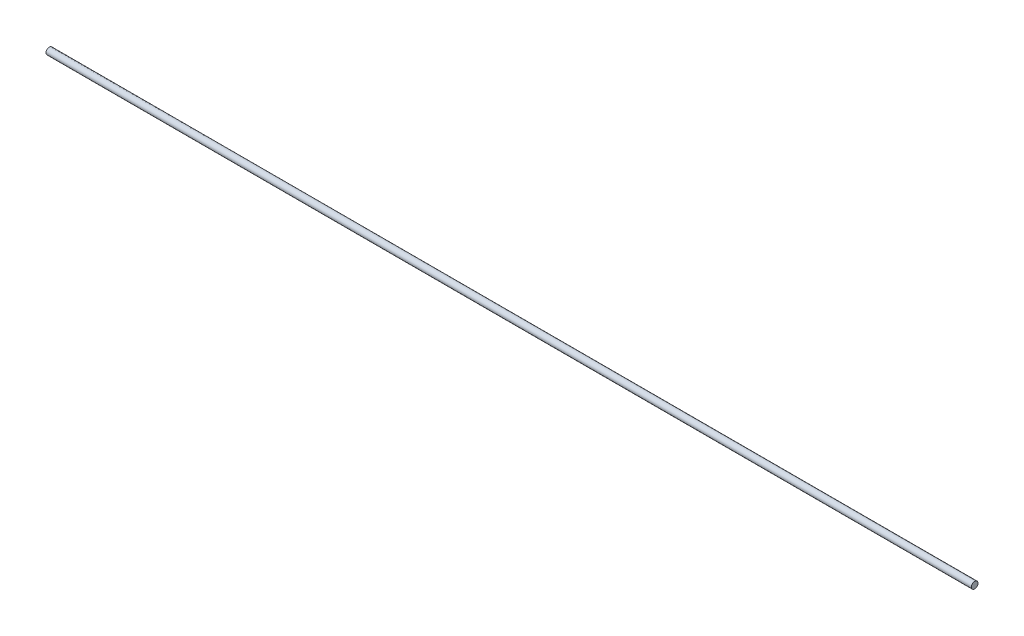
ISO-10303-21;
HEADER;
FILE_DESCRIPTION(('STEP AP214'),'2;1');
FILE_NAME('part.step','',(''),(''),'','','');
FILE_SCHEMA(('AUTOMOTIVE_DESIGN { 1 0 10303 214 1 1 1 1 }'));
ENDSEC;
DATA;
#1=APPLICATION_CONTEXT('core data for automotive mechanical design processes');
#2=APPLICATION_PROTOCOL_DEFINITION('international standard','automotive_design',2000,#1);
#3=PRODUCT_CONTEXT('',#1,'mechanical');
#4=PRODUCT('Part','Part','',(#3));
#5=PRODUCT_RELATED_PRODUCT_CATEGORY('part','',(#4));
#6=PRODUCT_DEFINITION_FORMATION('','',#4);
#7=PRODUCT_DEFINITION_CONTEXT('part definition',#1,'design');
#8=PRODUCT_DEFINITION('design','',#6,#7);
#9=PRODUCT_DEFINITION_SHAPE('','',#8);
#10=(LENGTH_UNIT() NAMED_UNIT(*) SI_UNIT(.MILLI.,.METRE.));
#11=(NAMED_UNIT(*) PLANE_ANGLE_UNIT() SI_UNIT($,.RADIAN.));
#12=(NAMED_UNIT(*) SI_UNIT($,.STERADIAN.) SOLID_ANGLE_UNIT());
#13=UNCERTAINTY_MEASURE_WITH_UNIT(LENGTH_MEASURE(1.E-05),#10,'distance_accuracy_value','');
#14=(GEOMETRIC_REPRESENTATION_CONTEXT(3) GLOBAL_UNCERTAINTY_ASSIGNED_CONTEXT((#13)) GLOBAL_UNIT_ASSIGNED_CONTEXT((#10,
#11,#12)) REPRESENTATION_CONTEXT('',''));
#15=CARTESIAN_POINT('',(0.,0.,0.));
#16=DIRECTION('',(0.,0.,1.));
#17=DIRECTION('',(1.,0.,0.));
#18=AXIS2_PLACEMENT_3D('',#15,#16,#17);
#19=CARTESIAN_POINT('',(0.,0.5,0.));
#20=DIRECTION('',(1.,0.,0.));
#21=DIRECTION('',(0.,0.,-1.));
#22=AXIS2_PLACEMENT_3D('',#19,#20,#21);
#23=PLANE('',#22);
#24=CARTESIAN_POINT('',(0.,0.,0.));
#25=DIRECTION('',(-1.,0.,0.));
#26=DIRECTION('',(0.,0.,1.));
#27=AXIS2_PLACEMENT_3D('',#24,#25,#26);
#28=CIRCLE('',#27,0.5);
#29=CARTESIAN_POINT('',(0.,0.,0.5));
#30=VERTEX_POINT('',#29);
#31=EDGE_CURVE('E36',#30,#30,#28,.T.);
#32=ORIENTED_EDGE('',*,*,#31,.T.);
#33=EDGE_LOOP('',(#32));
#34=FACE_BOUND('',#33,.T.);
#35=ADVANCED_FACE('F30',(#34),#23,.F.);
#36=CARTESIAN_POINT('',(140.,0.5,0.));
#37=DIRECTION('',(-1.,0.,0.));
#38=DIRECTION('',(0.,0.,1.));
#39=AXIS2_PLACEMENT_3D('',#36,#37,#38);
#40=PLANE('',#39);
#41=CARTESIAN_POINT('',(140.,0.,0.));
#42=DIRECTION('',(-1.,0.,0.));
#43=DIRECTION('',(0.,0.,1.));
#44=AXIS2_PLACEMENT_3D('',#41,#42,#43);
#45=CIRCLE('',#44,0.5);
#46=CARTESIAN_POINT('',(140.,0.,0.5));
#47=VERTEX_POINT('',#46);
#48=EDGE_CURVE('E10',#47,#47,#45,.T.);
#49=ORIENTED_EDGE('',*,*,#48,.F.);
#50=EDGE_LOOP('',(#49));
#51=FACE_BOUND('',#50,.T.);
#52=ADVANCED_FACE('F45',(#51),#40,.F.);
#53=CARTESIAN_POINT('',(0.,0.,0.));
#54=DIRECTION('',(-1.,0.,0.));
#55=DIRECTION('',(0.,0.,1.));
#56=AXIS2_PLACEMENT_3D('',#53,#54,#55);
#57=CYLINDRICAL_SURFACE('',#56,0.5);
#58=ORIENTED_EDGE('',*,*,#31,.F.);
#59=EDGE_LOOP('',(#58));
#60=FACE_BOUND('',#59,.T.);
#61=ORIENTED_EDGE('',*,*,#48,.T.);
#62=EDGE_LOOP('',(#61));
#63=FACE_BOUND('',#62,.T.);
#64=ADVANCED_FACE('F43',(#60,#63),#57,.T.);
#65=CLOSED_SHELL('',(#35,#52,#64));
#66=MANIFOLD_SOLID_BREP('B2',#65);
#67=ADVANCED_BREP_SHAPE_REPRESENTATION('',(#18,#66),#14);
#68=SHAPE_DEFINITION_REPRESENTATION(#9,#67);
ENDSEC;
END-ISO-10303-21;
